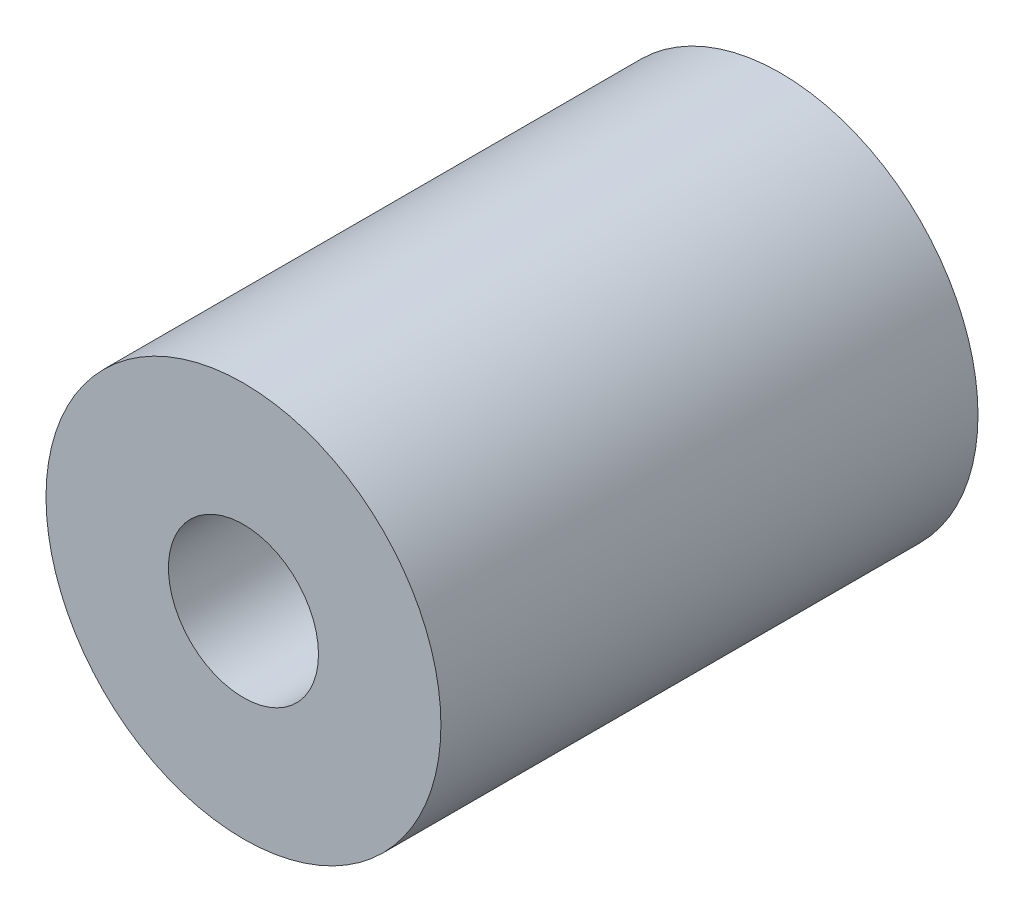
ISO-10303-21;
HEADER;
FILE_DESCRIPTION(('STEP AP214'),'2;1');
FILE_NAME('part.step','',(''),(''),'','','');
FILE_SCHEMA(('AUTOMOTIVE_DESIGN { 1 0 10303 214 1 1 1 1 }'));
ENDSEC;
DATA;
#1=APPLICATION_CONTEXT('core data for automotive mechanical design processes');
#2=APPLICATION_PROTOCOL_DEFINITION('international standard','automotive_design',2000,#1);
#3=PRODUCT_CONTEXT('',#1,'mechanical');
#4=PRODUCT('Part','Part','',(#3));
#5=PRODUCT_RELATED_PRODUCT_CATEGORY('part','',(#4));
#6=PRODUCT_DEFINITION_FORMATION('','',#4);
#7=PRODUCT_DEFINITION_CONTEXT('part definition',#1,'design');
#8=PRODUCT_DEFINITION('design','',#6,#7);
#9=PRODUCT_DEFINITION_SHAPE('','',#8);
#10=(LENGTH_UNIT() NAMED_UNIT(*) SI_UNIT(.MILLI.,.METRE.));
#11=(NAMED_UNIT(*) PLANE_ANGLE_UNIT() SI_UNIT($,.RADIAN.));
#12=(NAMED_UNIT(*) SI_UNIT($,.STERADIAN.) SOLID_ANGLE_UNIT());
#13=UNCERTAINTY_MEASURE_WITH_UNIT(LENGTH_MEASURE(1.E-05),#10,'distance_accuracy_value','');
#14=(GEOMETRIC_REPRESENTATION_CONTEXT(3) GLOBAL_UNCERTAINTY_ASSIGNED_CONTEXT((#13)) GLOBAL_UNIT_ASSIGNED_CONTEXT((#10,
#11,#12)) REPRESENTATION_CONTEXT('',''));
#15=CARTESIAN_POINT('',(0.,0.,0.));
#16=DIRECTION('',(0.,0.,1.));
#17=DIRECTION('',(1.,0.,0.));
#18=AXIS2_PLACEMENT_3D('',#15,#16,#17);
#19=CARTESIAN_POINT('',(0.,0.,150.));
#20=DIRECTION('',(0.,0.,1.));
#21=DIRECTION('',(1.,0.,0.));
#22=AXIS2_PLACEMENT_3D('',#19,#20,#21);
#23=CYLINDRICAL_SURFACE('',#22,6.);
#24=CARTESIAN_POINT('',(0.,0.,75.));
#25=DIRECTION('',(0.,0.,1.));
#26=DIRECTION('',(1.,0.,0.));
#27=AXIS2_PLACEMENT_3D('',#24,#25,#26);
#28=CIRCLE('',#27,6.);
#29=CARTESIAN_POINT('',(6.,0.,75.));
#30=VERTEX_POINT('',#29);
#31=EDGE_CURVE('E75',#30,#30,#28,.T.);
#32=ORIENTED_EDGE('',*,*,#31,.T.);
#33=EDGE_LOOP('',(#32));
#34=FACE_BOUND('',#33,.T.);
#35=CARTESIAN_POINT('',(0.,0.,55.));
#36=DIRECTION('',(0.,0.,1.));
#37=DIRECTION('',(1.,0.,0.));
#38=AXIS2_PLACEMENT_3D('',#35,#36,#37);
#39=CIRCLE('',#38,6.);
#40=CARTESIAN_POINT('',(6.,0.,55.));
#41=VERTEX_POINT('',#40);
#42=EDGE_CURVE('E10',#41,#41,#39,.T.);
#43=ORIENTED_EDGE('',*,*,#42,.F.);
#44=EDGE_LOOP('',(#43));
#45=FACE_BOUND('',#44,.T.);
#46=ADVANCED_FACE('F34',(#34,#45),#23,.F.);
#47=CARTESIAN_POINT('',(6.,0.,55.));
#48=DIRECTION('',(0.,0.,-1.));
#49=DIRECTION('',(-1.,0.,0.));
#50=AXIS2_PLACEMENT_3D('',#47,#48,#49);
#51=PLANE('',#50);
#52=ORIENTED_EDGE('',*,*,#42,.T.);
#53=EDGE_LOOP('',(#52));
#54=FACE_BOUND('',#53,.T.);
#55=CARTESIAN_POINT('',(0.,0.,55.));
#56=DIRECTION('',(0.,0.,1.));
#57=DIRECTION('',(1.,0.,0.));
#58=AXIS2_PLACEMENT_3D('',#55,#56,#57);
#59=CIRCLE('',#58,25.);
#60=CARTESIAN_POINT('',(25.,0.,55.));
#61=VERTEX_POINT('',#60);
#62=EDGE_CURVE('E45',#61,#61,#59,.T.);
#63=ORIENTED_EDGE('',*,*,#62,.F.);
#64=EDGE_LOOP('',(#63));
#65=FACE_BOUND('',#64,.T.);
#66=ADVANCED_FACE('F91',(#54,#65),#51,.T.);
#67=CARTESIAN_POINT('',(0.,0.,150.));
#68=DIRECTION('',(0.,0.,1.));
#69=DIRECTION('',(1.,0.,0.));
#70=AXIS2_PLACEMENT_3D('',#67,#68,#69);
#71=CYLINDRICAL_SURFACE('',#70,25.);
#72=ORIENTED_EDGE('',*,*,#62,.T.);
#73=EDGE_LOOP('',(#72));
#74=FACE_BOUND('',#73,.T.);
#75=CARTESIAN_POINT('',(0.,0.,123.));
#76=DIRECTION('',(0.,0.,1.));
#77=DIRECTION('',(1.,0.,0.));
#78=AXIS2_PLACEMENT_3D('',#75,#76,#77);
#79=CIRCLE('',#78,25.);
#80=CARTESIAN_POINT('',(25.,0.,123.));
#81=VERTEX_POINT('',#80);
#82=EDGE_CURVE('E48',#81,#81,#79,.T.);
#83=ORIENTED_EDGE('',*,*,#82,.F.);
#84=EDGE_LOOP('',(#83));
#85=FACE_BOUND('',#84,.T.);
#86=ADVANCED_FACE('F98',(#74,#85),#71,.T.);
#87=CARTESIAN_POINT('',(25.,0.,123.));
#88=DIRECTION('',(0.,0.,1.));
#89=DIRECTION('',(1.,0.,0.));
#90=AXIS2_PLACEMENT_3D('',#87,#88,#89);
#91=PLANE('',#90);
#92=ORIENTED_EDGE('',*,*,#82,.T.);
#93=EDGE_LOOP('',(#92));
#94=FACE_BOUND('',#93,.T.);
#95=CARTESIAN_POINT('',(0.,0.,123.));
#96=DIRECTION('',(0.,0.,1.));
#97=DIRECTION('',(1.,0.,0.));
#98=AXIS2_PLACEMENT_3D('',#95,#96,#97);
#99=CIRCLE('',#98,9.5);
#100=CARTESIAN_POINT('',(9.5,0.,123.));
#101=VERTEX_POINT('',#100);
#102=EDGE_CURVE('E53',#101,#101,#99,.T.);
#103=ORIENTED_EDGE('',*,*,#102,.F.);
#104=EDGE_LOOP('',(#103));
#105=FACE_BOUND('',#104,.T.);
#106=ADVANCED_FACE('F103',(#94,#105),#91,.T.);
#107=CARTESIAN_POINT('',(0.,0.,150.));
#108=DIRECTION('',(0.,0.,1.));
#109=DIRECTION('',(1.,0.,0.));
#110=AXIS2_PLACEMENT_3D('',#107,#108,#109);
#111=CYLINDRICAL_SURFACE('',#110,9.5);
#112=ORIENTED_EDGE('',*,*,#102,.T.);
#113=EDGE_LOOP('',(#112));
#114=FACE_BOUND('',#113,.T.);
#115=CARTESIAN_POINT('',(0.,0.,85.));
#116=DIRECTION('',(0.,0.,1.));
#117=DIRECTION('',(1.,0.,0.));
#118=AXIS2_PLACEMENT_3D('',#115,#116,#117);
#119=CIRCLE('',#118,9.5);
#120=CARTESIAN_POINT('',(9.5,0.,85.));
#121=VERTEX_POINT('',#120);
#122=EDGE_CURVE('E58',#121,#121,#119,.T.);
#123=ORIENTED_EDGE('',*,*,#122,.F.);
#124=EDGE_LOOP('',(#123));
#125=FACE_BOUND('',#124,.T.);
#126=ADVANCED_FACE('F108',(#114,#125),#111,.F.);
#127=CARTESIAN_POINT('',(9.5,0.,85.));
#128=DIRECTION('',(0.,0.,-1.));
#129=DIRECTION('',(-1.,0.,0.));
#130=AXIS2_PLACEMENT_3D('',#127,#128,#129);
#131=PLANE('',#130);
#132=ORIENTED_EDGE('',*,*,#122,.T.);
#133=EDGE_LOOP('',(#132));
#134=FACE_BOUND('',#133,.T.);
#135=CARTESIAN_POINT('',(0.,0.,85.));
#136=DIRECTION('',(0.,0.,1.));
#137=DIRECTION('',(1.,0.,0.));
#138=AXIS2_PLACEMENT_3D('',#135,#136,#137);
#139=CIRCLE('',#138,20.);
#140=CARTESIAN_POINT('',(20.,0.,85.));
#141=VERTEX_POINT('',#140);
#142=EDGE_CURVE('E61',#141,#141,#139,.T.);
#143=ORIENTED_EDGE('',*,*,#142,.F.);
#144=EDGE_LOOP('',(#143));
#145=FACE_BOUND('',#144,.T.);
#146=ADVANCED_FACE('F90',(#134,#145),#131,.T.);
#147=CARTESIAN_POINT('',(0.,0.,150.));
#148=DIRECTION('',(0.,0.,1.));
#149=DIRECTION('',(1.,0.,0.));
#150=AXIS2_PLACEMENT_3D('',#147,#148,#149);
#151=CYLINDRICAL_SURFACE('',#150,20.);
#152=ORIENTED_EDGE('',*,*,#142,.T.);
#153=EDGE_LOOP('',(#152));
#154=FACE_BOUND('',#153,.T.);
#155=CARTESIAN_POINT('',(0.,0.,75.));
#156=DIRECTION('',(0.,0.,1.));
#157=DIRECTION('',(1.,0.,0.));
#158=AXIS2_PLACEMENT_3D('',#155,#156,#157);
#159=CIRCLE('',#158,20.);
#160=CARTESIAN_POINT('',(20.,0.,75.));
#161=VERTEX_POINT('',#160);
#162=EDGE_CURVE('E70',#161,#161,#159,.T.);
#163=ORIENTED_EDGE('',*,*,#162,.F.);
#164=EDGE_LOOP('',(#163));
#165=FACE_BOUND('',#164,.T.);
#166=ADVANCED_FACE('F84',(#154,#165),#151,.F.);
#167=CARTESIAN_POINT('',(20.,0.,75.));
#168=DIRECTION('',(0.,0.,1.));
#169=DIRECTION('',(1.,0.,0.));
#170=AXIS2_PLACEMENT_3D('',#167,#168,#169);
#171=PLANE('',#170);
#172=ORIENTED_EDGE('',*,*,#162,.T.);
#173=EDGE_LOOP('',(#172));
#174=FACE_BOUND('',#173,.T.);
#175=ORIENTED_EDGE('',*,*,#31,.F.);
#176=EDGE_LOOP('',(#175));
#177=FACE_BOUND('',#176,.T.);
#178=ADVANCED_FACE('F78',(#174,#177),#171,.T.);
#179=CLOSED_SHELL('',(#46,#66,#86,#106,#126,#146,#166,#178));
#180=MANIFOLD_SOLID_BREP('B2',#179);
#181=ADVANCED_BREP_SHAPE_REPRESENTATION('',(#18,#180),#14);
#182=SHAPE_DEFINITION_REPRESENTATION(#9,#181);
ENDSEC;
END-ISO-10303-21;
